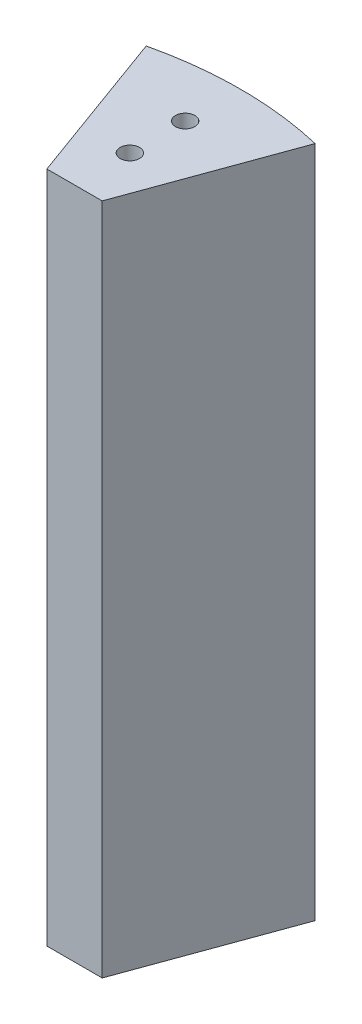
ISO-10303-21;
HEADER;
FILE_DESCRIPTION(('STEP AP214'),'2;1');
FILE_NAME('part.step','',(''),(''),'','','');
FILE_SCHEMA(('AUTOMOTIVE_DESIGN { 1 0 10303 214 1 1 1 1 }'));
ENDSEC;
DATA;
#1=APPLICATION_CONTEXT('core data for automotive mechanical design processes');
#2=APPLICATION_PROTOCOL_DEFINITION('international standard','automotive_design',2000,#1);
#3=PRODUCT_CONTEXT('',#1,'mechanical');
#4=PRODUCT('Part','Part','',(#3));
#5=PRODUCT_RELATED_PRODUCT_CATEGORY('part','',(#4));
#6=PRODUCT_DEFINITION_FORMATION('','',#4);
#7=PRODUCT_DEFINITION_CONTEXT('part definition',#1,'design');
#8=PRODUCT_DEFINITION('design','',#6,#7);
#9=PRODUCT_DEFINITION_SHAPE('','',#8);
#10=(LENGTH_UNIT() NAMED_UNIT(*) SI_UNIT(.MILLI.,.METRE.));
#11=(NAMED_UNIT(*) PLANE_ANGLE_UNIT() SI_UNIT($,.RADIAN.));
#12=(NAMED_UNIT(*) SI_UNIT($,.STERADIAN.) SOLID_ANGLE_UNIT());
#13=UNCERTAINTY_MEASURE_WITH_UNIT(LENGTH_MEASURE(1.E-05),#10,'distance_accuracy_value','');
#14=(GEOMETRIC_REPRESENTATION_CONTEXT(3) GLOBAL_UNCERTAINTY_ASSIGNED_CONTEXT((#13)) GLOBAL_UNIT_ASSIGNED_CONTEXT((#10,
#11,#12)) REPRESENTATION_CONTEXT('',''));
#15=CARTESIAN_POINT('',(0.,0.,0.));
#16=DIRECTION('',(0.,0.,1.));
#17=DIRECTION('',(1.,0.,0.));
#18=AXIS2_PLACEMENT_3D('',#15,#16,#17);
#19=CARTESIAN_POINT('',(-7.31576276898203,121.65,-2.66271988886238));
#20=DIRECTION('',(-0.939692620785907,0.,-0.342020143325672));
#21=DIRECTION('',(-0.342020143325672,0.,0.939692620785907));
#22=AXIS2_PLACEMENT_3D('',#19,#20,#21);
#23=PLANE('',#22);
#24=DIRECTION('',(0.342020143325673,0.,-0.939692620785907));
#25=VECTOR('',#24,1.);
#26=CARTESIAN_POINT('',(-7.31576276898203,0.,-2.66271988886238));
#27=LINE('',#26,#25);
#28=CARTESIAN_POINT('',(5.,0.,-36.5));
#29=VERTEX_POINT('',#28);
#30=CARTESIAN_POINT('',(15.2721743546691,0.,-64.7225670881539));
#31=VERTEX_POINT('',#30);
#32=EDGE_CURVE('E134',#29,#31,#27,.T.);
#33=ORIENTED_EDGE('',*,*,#32,.T.);
#34=DIRECTION('',(0.,-1.,0.));
#35=VECTOR('',#34,1.);
#36=CARTESIAN_POINT('',(15.2721743546691,121.65,-64.7225670881539));
#37=LINE('',#36,#35);
#38=CARTESIAN_POINT('',(15.2721743546691,121.65,-64.7225670881539));
#39=VERTEX_POINT('',#38);
#40=EDGE_CURVE('E13',#39,#31,#37,.T.);
#41=ORIENTED_EDGE('',*,*,#40,.F.);
#42=DIRECTION('',(0.342020143325673,0.,-0.939692620785907));
#43=VECTOR('',#42,1.);
#44=CARTESIAN_POINT('',(-7.31576276898203,121.65,-2.66271988886238));
#45=LINE('',#44,#43);
#46=CARTESIAN_POINT('',(5.,121.65,-36.5));
#47=VERTEX_POINT('',#46);
#48=EDGE_CURVE('E106',#47,#39,#45,.T.);
#49=ORIENTED_EDGE('',*,*,#48,.F.);
#50=DIRECTION('',(0.,-1.,0.));
#51=VECTOR('',#50,1.);
#52=CARTESIAN_POINT('',(5.,121.65,-36.5));
#53=LINE('',#52,#51);
#54=EDGE_CURVE('E72',#47,#29,#53,.T.);
#55=ORIENTED_EDGE('',*,*,#54,.T.);
#56=EDGE_LOOP('',(#33,#41,#49,#55));
#57=FACE_BOUND('',#56,.T.);
#58=ADVANCED_FACE('F54',(#57),#23,.F.);
#59=CARTESIAN_POINT('',(0.,121.65,0.));
#60=DIRECTION('',(0.,-1.,0.));
#61=DIRECTION('',(0.,0.,-1.));
#62=AXIS2_PLACEMENT_3D('',#59,#60,#61);
#63=CYLINDRICAL_SURFACE('',#62,66.5);
#64=CARTESIAN_POINT('',(0.,0.,0.));
#65=DIRECTION('',(0.,1.,0.));
#66=DIRECTION('',(0.,0.,1.));
#67=AXIS2_PLACEMENT_3D('',#64,#65,#66);
#68=CIRCLE('',#67,66.5);
#69=CARTESIAN_POINT('',(-15.2721743546689,0.,-64.722567088154));
#70=VERTEX_POINT('',#69);
#71=EDGE_CURVE('E112',#31,#70,#68,.T.);
#72=ORIENTED_EDGE('',*,*,#71,.T.);
#73=DIRECTION('',(0.,-1.,0.));
#74=VECTOR('',#73,1.);
#75=CARTESIAN_POINT('',(-15.2721743546689,121.65,-64.722567088154));
#76=LINE('',#75,#74);
#77=CARTESIAN_POINT('',(-15.2721743546689,121.65,-64.722567088154));
#78=VERTEX_POINT('',#77);
#79=EDGE_CURVE('E64',#78,#70,#76,.T.);
#80=ORIENTED_EDGE('',*,*,#79,.F.);
#81=CARTESIAN_POINT('',(0.,121.65,0.));
#82=DIRECTION('',(0.,1.,0.));
#83=DIRECTION('',(0.,0.,1.));
#84=AXIS2_PLACEMENT_3D('',#81,#82,#83);
#85=CIRCLE('',#84,66.5);
#86=EDGE_CURVE('E97',#39,#78,#85,.T.);
#87=ORIENTED_EDGE('',*,*,#86,.F.);
#88=ORIENTED_EDGE('',*,*,#40,.T.);
#89=EDGE_LOOP('',(#72,#80,#87,#88));
#90=FACE_BOUND('',#89,.T.);
#91=ADVANCED_FACE('F111',(#90),#63,.T.);
#92=CARTESIAN_POINT('',(7.31576276898181,121.65,-2.66271988886225));
#93=DIRECTION('',(-0.939692620785909,0.,0.342020143325666));
#94=DIRECTION('',(0.342020143325666,0.,0.939692620785909));
#95=AXIS2_PLACEMENT_3D('',#92,#93,#94);
#96=PLANE('',#95);
#97=DIRECTION('',(-0.342020143325666,0.,-0.939692620785909));
#98=VECTOR('',#97,1.);
#99=CARTESIAN_POINT('',(7.31576276898181,0.,-2.66271988886225));
#100=LINE('',#99,#98);
#101=CARTESIAN_POINT('',(-5.,0.,-36.5));
#102=VERTEX_POINT('',#101);
#103=EDGE_CURVE('E139',#102,#70,#100,.T.);
#104=ORIENTED_EDGE('',*,*,#103,.F.);
#105=DIRECTION('',(0.,-1.,0.));
#106=VECTOR('',#105,1.);
#107=CARTESIAN_POINT('',(-5.,121.65,-36.5));
#108=LINE('',#107,#106);
#109=CARTESIAN_POINT('',(-5.,121.65,-36.5));
#110=VERTEX_POINT('',#109);
#111=EDGE_CURVE('E86',#110,#102,#108,.T.);
#112=ORIENTED_EDGE('',*,*,#111,.F.);
#113=DIRECTION('',(-0.342020143325666,0.,-0.939692620785909));
#114=VECTOR('',#113,1.);
#115=CARTESIAN_POINT('',(7.31576276898181,121.65,-2.66271988886225));
#116=LINE('',#115,#114);
#117=EDGE_CURVE('E105',#110,#78,#116,.T.);
#118=ORIENTED_EDGE('',*,*,#117,.T.);
#119=ORIENTED_EDGE('',*,*,#79,.T.);
#120=EDGE_LOOP('',(#104,#112,#118,#119));
#121=FACE_BOUND('',#120,.T.);
#122=ADVANCED_FACE('F116',(#121),#96,.T.);
#123=CARTESIAN_POINT('',(0.,121.65,-36.5));
#124=DIRECTION('',(0.,0.,1.));
#125=DIRECTION('',(1.,0.,0.));
#126=AXIS2_PLACEMENT_3D('',#123,#124,#125);
#127=PLANE('',#126);
#128=DIRECTION('',(-1.,0.,0.));
#129=VECTOR('',#128,1.);
#130=CARTESIAN_POINT('',(0.,0.,-36.5));
#131=LINE('',#130,#129);
#132=EDGE_CURVE('E142',#29,#102,#131,.T.);
#133=ORIENTED_EDGE('',*,*,#132,.F.);
#134=ORIENTED_EDGE('',*,*,#54,.F.);
#135=DIRECTION('',(-1.,0.,0.));
#136=VECTOR('',#135,1.);
#137=CARTESIAN_POINT('',(0.,121.65,-36.5));
#138=LINE('',#137,#136);
#139=EDGE_CURVE('E118',#47,#110,#138,.T.);
#140=ORIENTED_EDGE('',*,*,#139,.T.);
#141=ORIENTED_EDGE('',*,*,#111,.T.);
#142=EDGE_LOOP('',(#133,#134,#140,#141));
#143=FACE_BOUND('',#142,.T.);
#144=ADVANCED_FACE('F210',(#143),#127,.T.);
#145=CARTESIAN_POINT('',(0.,121.65,-56.5));
#146=DIRECTION('',(0.,-1.,0.));
#147=DIRECTION('',(0.,0.,-1.));
#148=AXIS2_PLACEMENT_3D('',#145,#146,#147);
#149=CYLINDRICAL_SURFACE('',#148,1.75);
#150=CARTESIAN_POINT('',(0.,121.65,-56.5));
#151=DIRECTION('',(0.,1.,0.));
#152=DIRECTION('',(0.,0.,1.));
#153=AXIS2_PLACEMENT_3D('',#150,#151,#152);
#154=CIRCLE('',#153,1.75);
#155=CARTESIAN_POINT('',(0.,121.65,-58.25));
#156=VERTEX_POINT('',#155);
#157=EDGE_CURVE('E150',#156,#156,#154,.T.);
#158=CARTESIAN_POINT('',(0.,0.,-56.5));
#159=DIRECTION('',(0.,1.,0.));
#160=DIRECTION('',(0.,0.,1.));
#161=AXIS2_PLACEMENT_3D('',#158,#159,#160);
#162=CIRCLE('',#161,1.75);
#163=CARTESIAN_POINT('',(0.,0.,-58.25));
#164=VERTEX_POINT('',#163);
#165=EDGE_CURVE('E130',#164,#164,#162,.T.);
#166=CARTESIAN_POINT('',(0.,121.65,-58.25));
#167=CARTESIAN_POINT('',(0.,120.3828125,-58.25));
#168=CARTESIAN_POINT('',(0.,119.115625,-58.25));
#169=CARTESIAN_POINT('',(0.,116.58125,-58.25));
#170=CARTESIAN_POINT('',(0.,115.3140625,-58.25));
#171=CARTESIAN_POINT('',(0.,112.7796875,-58.25));
#172=CARTESIAN_POINT('',(0.,111.5125,-58.25));
#173=CARTESIAN_POINT('',(0.,108.978125,-58.25));
#174=CARTESIAN_POINT('',(0.,107.7109375,-58.25));
#175=CARTESIAN_POINT('',(0.,105.1765625,-58.25));
#176=CARTESIAN_POINT('',(0.,103.909375,-58.25));
#177=CARTESIAN_POINT('',(0.,101.375,-58.25));
#178=CARTESIAN_POINT('',(0.,100.1078125,-58.25));
#179=CARTESIAN_POINT('',(0.,97.5734375,-58.25));
#180=CARTESIAN_POINT('',(0.,96.30625,-58.25));
#181=CARTESIAN_POINT('',(0.,93.771875,-58.25));
#182=CARTESIAN_POINT('',(0.,92.5046875,-58.25));
#183=CARTESIAN_POINT('',(0.,89.9703125,-58.25));
#184=CARTESIAN_POINT('',(0.,88.703125,-58.25));
#185=CARTESIAN_POINT('',(0.,86.16875,-58.25));
#186=CARTESIAN_POINT('',(0.,84.9015625,-58.25));
#187=CARTESIAN_POINT('',(0.,82.3671875,-58.25));
#188=CARTESIAN_POINT('',(0.,81.1,-58.25));
#189=CARTESIAN_POINT('',(0.,78.565625,-58.25));
#190=CARTESIAN_POINT('',(0.,77.2984375,-58.25));
#191=CARTESIAN_POINT('',(0.,74.7640625,-58.25));
#192=CARTESIAN_POINT('',(0.,73.496875,-58.25));
#193=CARTESIAN_POINT('',(0.,70.9625,-58.25));
#194=CARTESIAN_POINT('',(0.,69.6953125,-58.25));
#195=CARTESIAN_POINT('',(0.,67.1609375,-58.25));
#196=CARTESIAN_POINT('',(0.,65.89375,-58.25));
#197=CARTESIAN_POINT('',(0.,63.359375,-58.25));
#198=CARTESIAN_POINT('',(0.,62.0921875,-58.25));
#199=CARTESIAN_POINT('',(0.,59.5578125,-58.25));
#200=CARTESIAN_POINT('',(0.,58.290625,-58.25));
#201=CARTESIAN_POINT('',(0.,55.75625,-58.25));
#202=CARTESIAN_POINT('',(0.,54.4890625,-58.25));
#203=CARTESIAN_POINT('',(0.,51.9546875,-58.25));
#204=CARTESIAN_POINT('',(0.,50.6875,-58.25));
#205=CARTESIAN_POINT('',(0.,48.153125,-58.25));
#206=CARTESIAN_POINT('',(0.,46.8859375,-58.25));
#207=CARTESIAN_POINT('',(0.,44.3515625,-58.25));
#208=CARTESIAN_POINT('',(0.,43.084375,-58.25));
#209=CARTESIAN_POINT('',(0.,40.55,-58.25));
#210=CARTESIAN_POINT('',(0.,39.2828125,-58.25));
#211=CARTESIAN_POINT('',(0.,36.7484375,-58.25));
#212=CARTESIAN_POINT('',(0.,35.48125,-58.25));
#213=CARTESIAN_POINT('',(0.,32.946875,-58.25));
#214=CARTESIAN_POINT('',(0.,31.6796875,-58.25));
#215=CARTESIAN_POINT('',(0.,29.1453125,-58.25));
#216=CARTESIAN_POINT('',(0.,27.878125,-58.25));
#217=CARTESIAN_POINT('',(0.,25.34375,-58.25));
#218=CARTESIAN_POINT('',(0.,24.0765625,-58.25));
#219=CARTESIAN_POINT('',(0.,21.5421875,-58.25));
#220=CARTESIAN_POINT('',(0.,20.275,-58.25));
#221=CARTESIAN_POINT('',(0.,17.740625,-58.25));
#222=CARTESIAN_POINT('',(0.,16.4734375,-58.25));
#223=CARTESIAN_POINT('',(0.,13.9390625,-58.25));
#224=CARTESIAN_POINT('',(0.,12.671875,-58.25));
#225=CARTESIAN_POINT('',(0.,10.1375,-58.25));
#226=CARTESIAN_POINT('',(0.,8.87031249999999,-58.25));
#227=CARTESIAN_POINT('',(0.,6.33593749999999,-58.25));
#228=CARTESIAN_POINT('',(0.,5.06874999999998,-58.25));
#229=CARTESIAN_POINT('',(0.,2.53437499999998,-58.25));
#230=CARTESIAN_POINT('',(0.,1.26718749999998,-58.25));
#231=CARTESIAN_POINT('',(0.,0.,-58.25));
#232=B_SPLINE_CURVE_WITH_KNOTS('',3,(#166,#167,#168,#169,#170,#171,#172,#173,#174,#175,#176,
#177,#178,#179,#180,#181,#182,#183,#184,#185,#186,#187,#188,#189,#190,#191,#192,#193,#194,#195,
#196,#197,#198,#199,#200,#201,#202,#203,#204,#205,#206,#207,#208,#209,#210,#211,#212,#213,#214,
#215,#216,#217,#218,#219,#220,#221,#222,#223,#224,#225,#226,#227,#228,#229,#230,#231),
.UNSPECIFIED.,.F.,.F.,(4,2,2,2,2,2,2,2,2,2,2,2,2,2,2,2,2,2,2,2,2,2,2,2,2,2,2,2,2,2,2,2,4),(0.,
3.80156250000001,7.603125,11.4046875,15.20625,19.0078125,22.809375,26.6109375,30.4125,
34.2140625,38.015625,41.8171875,45.61875,49.4203125,53.221875,57.0234375,60.825,64.6265625,
68.428125,72.2296875,76.03125,79.8328125,83.634375,87.4359375,91.2375,95.0390625,98.840625,
102.6421875,106.44375,110.2453125,114.046875,117.8484375,121.65),.UNSPECIFIED.);
#233=EDGE_CURVE('BSEAM56',#156,#164,#232,.T.);
#234=ORIENTED_EDGE('',*,*,#157,.T.);
#235=ORIENTED_EDGE('',*,*,#165,.F.);
#236=ORIENTED_EDGE('',*,*,#233,.T.);
#237=ORIENTED_EDGE('',*,*,#233,.F.);
#238=EDGE_LOOP('',(#234,#236,#235,#237));
#239=FACE_BOUND('',#238,.T.);
#240=ADVANCED_FACE('F56',(#239),#149,.F.);
#241=CARTESIAN_POINT('',(0.,121.65,-46.5));
#242=DIRECTION('',(0.,-1.,0.));
#243=DIRECTION('',(0.,0.,-1.));
#244=AXIS2_PLACEMENT_3D('',#241,#242,#243);
#245=CYLINDRICAL_SURFACE('',#244,1.75);
#246=CARTESIAN_POINT('',(0.,121.65,-46.5));
#247=DIRECTION('',(0.,1.,0.));
#248=DIRECTION('',(0.,0.,1.));
#249=AXIS2_PLACEMENT_3D('',#246,#247,#248);
#250=CIRCLE('',#249,1.75);
#251=CARTESIAN_POINT('',(0.,121.65,-48.25));
#252=VERTEX_POINT('',#251);
#253=EDGE_CURVE('E123',#252,#252,#250,.T.);
#254=CARTESIAN_POINT('',(0.,0.,-46.5));
#255=DIRECTION('',(0.,1.,0.));
#256=DIRECTION('',(0.,0.,1.));
#257=AXIS2_PLACEMENT_3D('',#254,#255,#256);
#258=CIRCLE('',#257,1.75);
#259=CARTESIAN_POINT('',(0.,0.,-48.25));
#260=VERTEX_POINT('',#259);
#261=EDGE_CURVE('E146',#260,#260,#258,.T.);
#262=CARTESIAN_POINT('',(0.,121.65,-48.25));
#263=CARTESIAN_POINT('',(0.,120.3828125,-48.25));
#264=CARTESIAN_POINT('',(0.,119.115625,-48.25));
#265=CARTESIAN_POINT('',(0.,116.58125,-48.25));
#266=CARTESIAN_POINT('',(0.,115.3140625,-48.25));
#267=CARTESIAN_POINT('',(0.,112.7796875,-48.25));
#268=CARTESIAN_POINT('',(0.,111.5125,-48.25));
#269=CARTESIAN_POINT('',(0.,108.978125,-48.25));
#270=CARTESIAN_POINT('',(0.,107.7109375,-48.25));
#271=CARTESIAN_POINT('',(0.,105.1765625,-48.25));
#272=CARTESIAN_POINT('',(0.,103.909375,-48.25));
#273=CARTESIAN_POINT('',(0.,101.375,-48.25));
#274=CARTESIAN_POINT('',(0.,100.1078125,-48.25));
#275=CARTESIAN_POINT('',(0.,97.5734375,-48.25));
#276=CARTESIAN_POINT('',(0.,96.30625,-48.25));
#277=CARTESIAN_POINT('',(0.,93.771875,-48.25));
#278=CARTESIAN_POINT('',(0.,92.5046875,-48.25));
#279=CARTESIAN_POINT('',(0.,89.9703125,-48.25));
#280=CARTESIAN_POINT('',(0.,88.703125,-48.25));
#281=CARTESIAN_POINT('',(0.,86.16875,-48.25));
#282=CARTESIAN_POINT('',(0.,84.9015625,-48.25));
#283=CARTESIAN_POINT('',(0.,82.3671875,-48.25));
#284=CARTESIAN_POINT('',(0.,81.1,-48.25));
#285=CARTESIAN_POINT('',(0.,78.565625,-48.25));
#286=CARTESIAN_POINT('',(0.,77.2984375,-48.25));
#287=CARTESIAN_POINT('',(0.,74.7640625,-48.25));
#288=CARTESIAN_POINT('',(0.,73.496875,-48.25));
#289=CARTESIAN_POINT('',(0.,70.9625,-48.25));
#290=CARTESIAN_POINT('',(0.,69.6953125,-48.25));
#291=CARTESIAN_POINT('',(0.,67.1609375,-48.25));
#292=CARTESIAN_POINT('',(0.,65.89375,-48.25));
#293=CARTESIAN_POINT('',(0.,63.359375,-48.25));
#294=CARTESIAN_POINT('',(0.,62.0921875,-48.25));
#295=CARTESIAN_POINT('',(0.,59.5578125,-48.25));
#296=CARTESIAN_POINT('',(0.,58.290625,-48.25));
#297=CARTESIAN_POINT('',(0.,55.75625,-48.25));
#298=CARTESIAN_POINT('',(0.,54.4890625,-48.25));
#299=CARTESIAN_POINT('',(0.,51.9546875,-48.25));
#300=CARTESIAN_POINT('',(0.,50.6875,-48.25));
#301=CARTESIAN_POINT('',(0.,48.153125,-48.25));
#302=CARTESIAN_POINT('',(0.,46.8859375,-48.25));
#303=CARTESIAN_POINT('',(0.,44.3515625,-48.25));
#304=CARTESIAN_POINT('',(0.,43.084375,-48.25));
#305=CARTESIAN_POINT('',(0.,40.55,-48.25));
#306=CARTESIAN_POINT('',(0.,39.2828125,-48.25));
#307=CARTESIAN_POINT('',(0.,36.7484375,-48.25));
#308=CARTESIAN_POINT('',(0.,35.48125,-48.25));
#309=CARTESIAN_POINT('',(0.,32.946875,-48.25));
#310=CARTESIAN_POINT('',(0.,31.6796875,-48.25));
#311=CARTESIAN_POINT('',(0.,29.1453125,-48.25));
#312=CARTESIAN_POINT('',(0.,27.878125,-48.25));
#313=CARTESIAN_POINT('',(0.,25.34375,-48.25));
#314=CARTESIAN_POINT('',(0.,24.0765625,-48.25));
#315=CARTESIAN_POINT('',(0.,21.5421875,-48.25));
#316=CARTESIAN_POINT('',(0.,20.275,-48.25));
#317=CARTESIAN_POINT('',(0.,17.740625,-48.25));
#318=CARTESIAN_POINT('',(0.,16.4734375,-48.25));
#319=CARTESIAN_POINT('',(0.,13.9390625,-48.25));
#320=CARTESIAN_POINT('',(0.,12.671875,-48.25));
#321=CARTESIAN_POINT('',(0.,10.1375,-48.25));
#322=CARTESIAN_POINT('',(0.,8.87031249999999,-48.25));
#323=CARTESIAN_POINT('',(0.,6.33593749999999,-48.25));
#324=CARTESIAN_POINT('',(0.,5.06874999999998,-48.25));
#325=CARTESIAN_POINT('',(0.,2.53437499999998,-48.25));
#326=CARTESIAN_POINT('',(0.,1.26718749999998,-48.25));
#327=CARTESIAN_POINT('',(0.,0.,-48.25));
#328=B_SPLINE_CURVE_WITH_KNOTS('',3,(#262,#263,#264,#265,#266,#267,#268,#269,#270,#271,#272,
#273,#274,#275,#276,#277,#278,#279,#280,#281,#282,#283,#284,#285,#286,#287,#288,#289,#290,#291,
#292,#293,#294,#295,#296,#297,#298,#299,#300,#301,#302,#303,#304,#305,#306,#307,#308,#309,#310,
#311,#312,#313,#314,#315,#316,#317,#318,#319,#320,#321,#322,#323,#324,#325,#326,#327),
.UNSPECIFIED.,.F.,.F.,(4,2,2,2,2,2,2,2,2,2,2,2,2,2,2,2,2,2,2,2,2,2,2,2,2,2,2,2,2,2,2,2,4),(0.,
3.80156250000001,7.603125,11.4046875,15.20625,19.0078125,22.809375,26.6109375,30.4125,
34.2140625,38.015625,41.8171875,45.61875,49.4203125,53.221875,57.0234375,60.825,64.6265625,
68.428125,72.2296875,76.03125,79.8328125,83.634375,87.4359375,91.2375,95.0390625,98.840625,
102.6421875,106.44375,110.2453125,114.046875,117.8484375,121.65),.UNSPECIFIED.);
#329=EDGE_CURVE('BSEAM192',#252,#260,#328,.T.);
#330=ORIENTED_EDGE('',*,*,#253,.T.);
#331=ORIENTED_EDGE('',*,*,#261,.F.);
#332=ORIENTED_EDGE('',*,*,#329,.T.);
#333=ORIENTED_EDGE('',*,*,#329,.F.);
#334=EDGE_LOOP('',(#330,#332,#331,#333));
#335=FACE_BOUND('',#334,.T.);
#336=ADVANCED_FACE('F192',(#335),#245,.F.);
#337=CARTESIAN_POINT('',(0.,121.65,0.));
#338=DIRECTION('',(0.,1.,0.));
#339=DIRECTION('',(0.,0.,1.));
#340=AXIS2_PLACEMENT_3D('',#337,#338,#339);
#341=PLANE('',#340);
#342=ORIENTED_EDGE('',*,*,#157,.F.);
#343=EDGE_LOOP('',(#342));
#344=FACE_BOUND('',#343,.T.);
#345=ORIENTED_EDGE('',*,*,#48,.T.);
#346=ORIENTED_EDGE('',*,*,#86,.T.);
#347=ORIENTED_EDGE('',*,*,#117,.F.);
#348=ORIENTED_EDGE('',*,*,#139,.F.);
#349=EDGE_LOOP('',(#345,#346,#347,#348));
#350=FACE_BOUND('',#349,.T.);
#351=ORIENTED_EDGE('',*,*,#253,.F.);
#352=EDGE_LOOP('',(#351));
#353=FACE_BOUND('',#352,.T.);
#354=ADVANCED_FACE('F101',(#344,#350,#353),#341,.T.);
#355=CARTESIAN_POINT('',(0.,0.,0.));
#356=DIRECTION('',(0.,1.,0.));
#357=DIRECTION('',(0.,0.,1.));
#358=AXIS2_PLACEMENT_3D('',#355,#356,#357);
#359=PLANE('',#358);
#360=ORIENTED_EDGE('',*,*,#165,.T.);
#361=EDGE_LOOP('',(#360));
#362=FACE_BOUND('',#361,.T.);
#363=ORIENTED_EDGE('',*,*,#32,.F.);
#364=ORIENTED_EDGE('',*,*,#132,.T.);
#365=ORIENTED_EDGE('',*,*,#103,.T.);
#366=ORIENTED_EDGE('',*,*,#71,.F.);
#367=EDGE_LOOP('',(#363,#364,#365,#366));
#368=FACE_BOUND('',#367,.T.);
#369=ORIENTED_EDGE('',*,*,#261,.T.);
#370=EDGE_LOOP('',(#369));
#371=FACE_BOUND('',#370,.T.);
#372=ADVANCED_FACE('F191',(#362,#368,#371),#359,.F.);
#373=CLOSED_SHELL('',(#58,#91,#122,#144,#240,#336,#354,#372));
#374=MANIFOLD_SOLID_BREP('B2',#373);
#375=ADVANCED_BREP_SHAPE_REPRESENTATION('',(#18,#374),#14);
#376=SHAPE_DEFINITION_REPRESENTATION(#9,#375);
ENDSEC;
END-ISO-10303-21;
